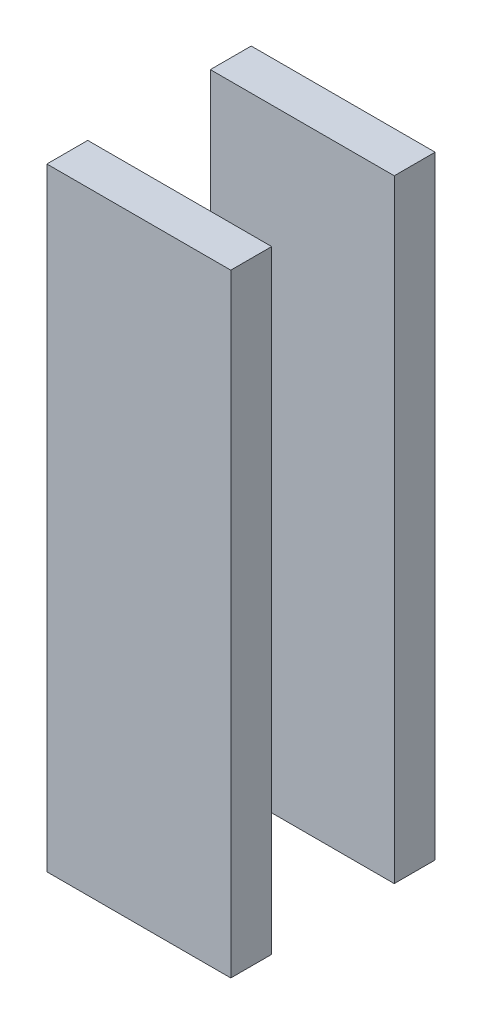
ISO-10303-21;
HEADER;
FILE_DESCRIPTION(('STEP AP214'),'2;1');
FILE_NAME('part.step','',(''),(''),'','','');
FILE_SCHEMA(('AUTOMOTIVE_DESIGN { 1 0 10303 214 1 1 1 1 }'));
ENDSEC;
DATA;
#1=APPLICATION_CONTEXT('core data for automotive mechanical design processes');
#2=APPLICATION_PROTOCOL_DEFINITION('international standard','automotive_design',2000,#1);
#3=PRODUCT_CONTEXT('',#1,'mechanical');
#4=PRODUCT('Part','Part','',(#3));
#5=PRODUCT_RELATED_PRODUCT_CATEGORY('part','',(#4));
#6=PRODUCT_DEFINITION_FORMATION('','',#4);
#7=PRODUCT_DEFINITION_CONTEXT('part definition',#1,'design');
#8=PRODUCT_DEFINITION('design','',#6,#7);
#9=PRODUCT_DEFINITION_SHAPE('','',#8);
#10=(LENGTH_UNIT() NAMED_UNIT(*) SI_UNIT(.MILLI.,.METRE.));
#11=(NAMED_UNIT(*) PLANE_ANGLE_UNIT() SI_UNIT($,.RADIAN.));
#12=(NAMED_UNIT(*) SI_UNIT($,.STERADIAN.) SOLID_ANGLE_UNIT());
#13=UNCERTAINTY_MEASURE_WITH_UNIT(LENGTH_MEASURE(1.E-05),#10,'distance_accuracy_value','');
#14=(GEOMETRIC_REPRESENTATION_CONTEXT(3) GLOBAL_UNCERTAINTY_ASSIGNED_CONTEXT((#13)) GLOBAL_UNIT_ASSIGNED_CONTEXT((#10,
#11,#12)) REPRESENTATION_CONTEXT('',''));
#15=CARTESIAN_POINT('',(0.,0.,0.));
#16=DIRECTION('',(0.,0.,1.));
#17=DIRECTION('',(1.,0.,0.));
#18=AXIS2_PLACEMENT_3D('',#15,#16,#17);
#19=CARTESIAN_POINT('',(-11.5229110512129,150.,-5.36388140161725));
#20=DIRECTION('',(1.,0.,0.));
#21=DIRECTION('',(0.,0.,-1.));
#22=AXIS2_PLACEMENT_3D('',#19,#20,#21);
#23=PLANE('',#22);
#24=DIRECTION('',(0.,0.,1.));
#25=VECTOR('',#24,1.);
#26=CARTESIAN_POINT('',(-11.5229110512129,0.,-5.36388140161725));
#27=LINE('',#26,#25);
#28=CARTESIAN_POINT('',(-11.5229110512129,0.,-5.36388140161725));
#29=VERTEX_POINT('',#28);
#30=CARTESIAN_POINT('',(-11.5229110512129,0.,4.63611859838275));
#31=VERTEX_POINT('',#30);
#32=EDGE_CURVE('E108',#29,#31,#27,.T.);
#33=ORIENTED_EDGE('',*,*,#32,.T.);
#34=DIRECTION('',(0.,-1.,0.));
#35=VECTOR('',#34,1.);
#36=CARTESIAN_POINT('',(-11.5229110512129,150.,4.63611859838275));
#37=LINE('',#36,#35);
#38=CARTESIAN_POINT('',(-11.5229110512129,150.,4.63611859838275));
#39=VERTEX_POINT('',#38);
#40=EDGE_CURVE('E12',#39,#31,#37,.T.);
#41=ORIENTED_EDGE('',*,*,#40,.F.);
#42=DIRECTION('',(0.,0.,1.));
#43=VECTOR('',#42,1.);
#44=CARTESIAN_POINT('',(-11.5229110512129,150.,-5.36388140161725));
#45=LINE('',#44,#43);
#46=CARTESIAN_POINT('',(-11.5229110512129,150.,-5.36388140161725));
#47=VERTEX_POINT('',#46);
#48=EDGE_CURVE('E96',#47,#39,#45,.T.);
#49=ORIENTED_EDGE('',*,*,#48,.F.);
#50=DIRECTION('',(0.,-1.,0.));
#51=VECTOR('',#50,1.);
#52=CARTESIAN_POINT('',(-11.5229110512129,150.,-5.36388140161725));
#53=LINE('',#52,#51);
#54=EDGE_CURVE('E104',#47,#29,#53,.T.);
#55=ORIENTED_EDGE('',*,*,#54,.T.);
#56=EDGE_LOOP('',(#33,#41,#49,#55));
#57=FACE_BOUND('',#56,.T.);
#58=ADVANCED_FACE('F45',(#57),#23,.F.);
#59=CARTESIAN_POINT('',(-11.5229110512129,150.,4.63611859838275));
#60=DIRECTION('',(0.,0.,-1.));
#61=DIRECTION('',(-1.,0.,0.));
#62=AXIS2_PLACEMENT_3D('',#59,#60,#61);
#63=PLANE('',#62);
#64=DIRECTION('',(1.,0.,0.));
#65=VECTOR('',#64,1.);
#66=CARTESIAN_POINT('',(-11.5229110512129,0.,4.63611859838275));
#67=LINE('',#66,#65);
#68=CARTESIAN_POINT('',(33.4770889487871,0.,4.63611859838275));
#69=VERTEX_POINT('',#68);
#70=EDGE_CURVE('E100',#31,#69,#67,.T.);
#71=ORIENTED_EDGE('',*,*,#70,.T.);
#72=DIRECTION('',(0.,-1.,0.));
#73=VECTOR('',#72,1.);
#74=CARTESIAN_POINT('',(33.4770889487871,150.,4.63611859838275));
#75=LINE('',#74,#73);
#76=CARTESIAN_POINT('',(33.4770889487871,150.,4.63611859838275));
#77=VERTEX_POINT('',#76);
#78=EDGE_CURVE('E53',#77,#69,#75,.T.);
#79=ORIENTED_EDGE('',*,*,#78,.F.);
#80=DIRECTION('',(1.,0.,0.));
#81=VECTOR('',#80,1.);
#82=CARTESIAN_POINT('',(-11.5229110512129,150.,4.63611859838275));
#83=LINE('',#82,#81);
#84=EDGE_CURVE('E91',#39,#77,#83,.T.);
#85=ORIENTED_EDGE('',*,*,#84,.F.);
#86=ORIENTED_EDGE('',*,*,#40,.T.);
#87=EDGE_LOOP('',(#71,#79,#85,#86));
#88=FACE_BOUND('',#87,.T.);
#89=ADVANCED_FACE('F99',(#88),#63,.F.);
#90=CARTESIAN_POINT('',(33.4770889487871,150.,-5.36388140161726));
#91=DIRECTION('',(-1.,0.,0.));
#92=DIRECTION('',(0.,0.,1.));
#93=AXIS2_PLACEMENT_3D('',#90,#91,#92);
#94=PLANE('',#93);
#95=DIRECTION('',(0.,0.,-1.));
#96=VECTOR('',#95,1.);
#97=CARTESIAN_POINT('',(33.4770889487871,0.,-5.36388140161726));
#98=LINE('',#97,#96);
#99=CARTESIAN_POINT('',(33.4770889487871,0.,-5.36388140161726));
#100=VERTEX_POINT('',#99);
#101=EDGE_CURVE('E78',#69,#100,#98,.T.);
#102=ORIENTED_EDGE('',*,*,#101,.T.);
#103=DIRECTION('',(0.,-1.,0.));
#104=VECTOR('',#103,1.);
#105=CARTESIAN_POINT('',(33.4770889487871,150.,-5.36388140161726));
#106=LINE('',#105,#104);
#107=CARTESIAN_POINT('',(33.4770889487871,150.,-5.36388140161726));
#108=VERTEX_POINT('',#107);
#109=EDGE_CURVE('E101',#108,#100,#106,.T.);
#110=ORIENTED_EDGE('',*,*,#109,.F.);
#111=DIRECTION('',(0.,0.,-1.));
#112=VECTOR('',#111,1.);
#113=CARTESIAN_POINT('',(33.4770889487871,150.,-5.36388140161726));
#114=LINE('',#113,#112);
#115=EDGE_CURVE('E94',#77,#108,#114,.T.);
#116=ORIENTED_EDGE('',*,*,#115,.F.);
#117=ORIENTED_EDGE('',*,*,#78,.T.);
#118=EDGE_LOOP('',(#102,#110,#116,#117));
#119=FACE_BOUND('',#118,.T.);
#120=ADVANCED_FACE('F102',(#119),#94,.F.);
#121=CARTESIAN_POINT('',(-11.5229110512129,150.,-5.36388140161725));
#122=DIRECTION('',(0.,0.,1.));
#123=DIRECTION('',(1.,0.,0.));
#124=AXIS2_PLACEMENT_3D('',#121,#122,#123);
#125=PLANE('',#124);
#126=DIRECTION('',(-1.,0.,0.));
#127=VECTOR('',#126,1.);
#128=CARTESIAN_POINT('',(-11.5229110512129,0.,-5.36388140161725));
#129=LINE('',#128,#127);
#130=EDGE_CURVE('E84',#100,#29,#129,.T.);
#131=ORIENTED_EDGE('',*,*,#130,.T.);
#132=ORIENTED_EDGE('',*,*,#54,.F.);
#133=DIRECTION('',(-1.,0.,0.));
#134=VECTOR('',#133,1.);
#135=CARTESIAN_POINT('',(-11.5229110512129,150.,-5.36388140161725));
#136=LINE('',#135,#134);
#137=EDGE_CURVE('E61',#108,#47,#136,.T.);
#138=ORIENTED_EDGE('',*,*,#137,.F.);
#139=ORIENTED_EDGE('',*,*,#109,.T.);
#140=EDGE_LOOP('',(#131,#132,#138,#139));
#141=FACE_BOUND('',#140,.T.);
#142=ADVANCED_FACE('F115',(#141),#125,.F.);
#143=CARTESIAN_POINT('',(0.,150.,0.));
#144=DIRECTION('',(0.,1.,0.));
#145=DIRECTION('',(0.,0.,1.));
#146=AXIS2_PLACEMENT_3D('',#143,#144,#145);
#147=PLANE('',#146);
#148=ORIENTED_EDGE('',*,*,#48,.T.);
#149=ORIENTED_EDGE('',*,*,#84,.T.);
#150=ORIENTED_EDGE('',*,*,#115,.T.);
#151=ORIENTED_EDGE('',*,*,#137,.T.);
#152=EDGE_LOOP('',(#148,#149,#150,#151));
#153=FACE_BOUND('',#152,.T.);
#154=ADVANCED_FACE('F92',(#153),#147,.T.);
#155=CARTESIAN_POINT('',(0.,0.,0.));
#156=DIRECTION('',(0.,1.,0.));
#157=DIRECTION('',(0.,0.,1.));
#158=AXIS2_PLACEMENT_3D('',#155,#156,#157);
#159=PLANE('',#158);
#160=ORIENTED_EDGE('',*,*,#32,.F.);
#161=ORIENTED_EDGE('',*,*,#130,.F.);
#162=ORIENTED_EDGE('',*,*,#101,.F.);
#163=ORIENTED_EDGE('',*,*,#70,.F.);
#164=EDGE_LOOP('',(#160,#161,#162,#163));
#165=FACE_BOUND('',#164,.T.);
#166=ADVANCED_FACE('F118',(#165),#159,.F.);
#167=CLOSED_SHELL('',(#58,#89,#120,#142,#154,#166));
#168=MANIFOLD_SOLID_BREP('B2',#167);
#169=CARTESIAN_POINT('',(-11.5229110512129,150.,-45.3638814016173));
#170=DIRECTION('',(1.,0.,0.));
#171=DIRECTION('',(0.,0.,-1.));
#172=AXIS2_PLACEMENT_3D('',#169,#170,#171);
#173=PLANE('',#172);
#174=DIRECTION('',(0.,0.,1.));
#175=VECTOR('',#174,1.);
#176=CARTESIAN_POINT('',(-11.5229110512129,0.,-45.3638814016173));
#177=LINE('',#176,#175);
#178=CARTESIAN_POINT('',(-11.5229110512129,0.,-45.3638814016173));
#179=VERTEX_POINT('',#178);
#180=CARTESIAN_POINT('',(-11.5229110512129,0.,-35.3638814016173));
#181=VERTEX_POINT('',#180);
#182=EDGE_CURVE('E232',#179,#181,#177,.T.);
#183=ORIENTED_EDGE('',*,*,#182,.T.);
#184=DIRECTION('',(0.,-1.,0.));
#185=VECTOR('',#184,1.);
#186=CARTESIAN_POINT('',(-11.5229110512129,150.,-35.3638814016173));
#187=LINE('',#186,#185);
#188=CARTESIAN_POINT('',(-11.5229110512129,150.,-35.3638814016173));
#189=VERTEX_POINT('',#188);
#190=EDGE_CURVE('E43',#189,#181,#187,.T.);
#191=ORIENTED_EDGE('',*,*,#190,.F.);
#192=DIRECTION('',(0.,0.,1.));
#193=VECTOR('',#192,1.);
#194=CARTESIAN_POINT('',(-11.5229110512129,150.,-45.3638814016173));
#195=LINE('',#194,#193);
#196=CARTESIAN_POINT('',(-11.5229110512129,150.,-45.3638814016173));
#197=VERTEX_POINT('',#196);
#198=EDGE_CURVE('E220',#197,#189,#195,.T.);
#199=ORIENTED_EDGE('',*,*,#198,.F.);
#200=DIRECTION('',(0.,-1.,0.));
#201=VECTOR('',#200,1.);
#202=CARTESIAN_POINT('',(-11.5229110512129,150.,-45.3638814016173));
#203=LINE('',#202,#201);
#204=EDGE_CURVE('E228',#197,#179,#203,.T.);
#205=ORIENTED_EDGE('',*,*,#204,.T.);
#206=EDGE_LOOP('',(#183,#191,#199,#205));
#207=FACE_BOUND('',#206,.T.);
#208=ADVANCED_FACE('F169',(#207),#173,.F.);
#209=CARTESIAN_POINT('',(-11.5229110512129,150.,-35.3638814016173));
#210=DIRECTION('',(0.,0.,-1.));
#211=DIRECTION('',(-1.,0.,0.));
#212=AXIS2_PLACEMENT_3D('',#209,#210,#211);
#213=PLANE('',#212);
#214=DIRECTION('',(1.,0.,0.));
#215=VECTOR('',#214,1.);
#216=CARTESIAN_POINT('',(-11.5229110512129,0.,-35.3638814016173));
#217=LINE('',#216,#215);
#218=CARTESIAN_POINT('',(33.4770889487871,0.,-35.3638814016173));
#219=VERTEX_POINT('',#218);
#220=EDGE_CURVE('E224',#181,#219,#217,.T.);
#221=ORIENTED_EDGE('',*,*,#220,.T.);
#222=DIRECTION('',(0.,-1.,0.));
#223=VECTOR('',#222,1.);
#224=CARTESIAN_POINT('',(33.4770889487871,150.,-35.3638814016173));
#225=LINE('',#224,#223);
#226=CARTESIAN_POINT('',(33.4770889487871,150.,-35.3638814016173));
#227=VERTEX_POINT('',#226);
#228=EDGE_CURVE('E177',#227,#219,#225,.T.);
#229=ORIENTED_EDGE('',*,*,#228,.F.);
#230=DIRECTION('',(1.,0.,0.));
#231=VECTOR('',#230,1.);
#232=CARTESIAN_POINT('',(-11.5229110512129,150.,-35.3638814016173));
#233=LINE('',#232,#231);
#234=EDGE_CURVE('E215',#189,#227,#233,.T.);
#235=ORIENTED_EDGE('',*,*,#234,.F.);
#236=ORIENTED_EDGE('',*,*,#190,.T.);
#237=EDGE_LOOP('',(#221,#229,#235,#236));
#238=FACE_BOUND('',#237,.T.);
#239=ADVANCED_FACE('F223',(#238),#213,.F.);
#240=CARTESIAN_POINT('',(33.4770889487871,150.,-45.3638814016173));
#241=DIRECTION('',(-1.,0.,0.));
#242=DIRECTION('',(0.,0.,1.));
#243=AXIS2_PLACEMENT_3D('',#240,#241,#242);
#244=PLANE('',#243);
#245=DIRECTION('',(0.,0.,-1.));
#246=VECTOR('',#245,1.);
#247=CARTESIAN_POINT('',(33.4770889487871,0.,-45.3638814016173));
#248=LINE('',#247,#246);
#249=CARTESIAN_POINT('',(33.4770889487871,0.,-45.3638814016173));
#250=VERTEX_POINT('',#249);
#251=EDGE_CURVE('E202',#219,#250,#248,.T.);
#252=ORIENTED_EDGE('',*,*,#251,.T.);
#253=DIRECTION('',(0.,-1.,0.));
#254=VECTOR('',#253,1.);
#255=CARTESIAN_POINT('',(33.4770889487871,150.,-45.3638814016173));
#256=LINE('',#255,#254);
#257=CARTESIAN_POINT('',(33.4770889487871,150.,-45.3638814016173));
#258=VERTEX_POINT('',#257);
#259=EDGE_CURVE('E225',#258,#250,#256,.T.);
#260=ORIENTED_EDGE('',*,*,#259,.F.);
#261=DIRECTION('',(0.,0.,-1.));
#262=VECTOR('',#261,1.);
#263=CARTESIAN_POINT('',(33.4770889487871,150.,-45.3638814016173));
#264=LINE('',#263,#262);
#265=EDGE_CURVE('E218',#227,#258,#264,.T.);
#266=ORIENTED_EDGE('',*,*,#265,.F.);
#267=ORIENTED_EDGE('',*,*,#228,.T.);
#268=EDGE_LOOP('',(#252,#260,#266,#267));
#269=FACE_BOUND('',#268,.T.);
#270=ADVANCED_FACE('F226',(#269),#244,.F.);
#271=CARTESIAN_POINT('',(-11.5229110512129,150.,-45.3638814016173));
#272=DIRECTION('',(0.,0.,1.));
#273=DIRECTION('',(1.,0.,0.));
#274=AXIS2_PLACEMENT_3D('',#271,#272,#273);
#275=PLANE('',#274);
#276=DIRECTION('',(-1.,0.,0.));
#277=VECTOR('',#276,1.);
#278=CARTESIAN_POINT('',(-11.5229110512129,0.,-45.3638814016173));
#279=LINE('',#278,#277);
#280=EDGE_CURVE('E208',#250,#179,#279,.T.);
#281=ORIENTED_EDGE('',*,*,#280,.T.);
#282=ORIENTED_EDGE('',*,*,#204,.F.);
#283=DIRECTION('',(-1.,0.,0.));
#284=VECTOR('',#283,1.);
#285=CARTESIAN_POINT('',(-11.5229110512129,150.,-45.3638814016173));
#286=LINE('',#285,#284);
#287=EDGE_CURVE('E185',#258,#197,#286,.T.);
#288=ORIENTED_EDGE('',*,*,#287,.F.);
#289=ORIENTED_EDGE('',*,*,#259,.T.);
#290=EDGE_LOOP('',(#281,#282,#288,#289));
#291=FACE_BOUND('',#290,.T.);
#292=ADVANCED_FACE('F239',(#291),#275,.F.);
#293=CARTESIAN_POINT('',(0.,150.,0.));
#294=DIRECTION('',(0.,1.,0.));
#295=DIRECTION('',(0.,0.,1.));
#296=AXIS2_PLACEMENT_3D('',#293,#294,#295);
#297=PLANE('',#296);
#298=ORIENTED_EDGE('',*,*,#198,.T.);
#299=ORIENTED_EDGE('',*,*,#234,.T.);
#300=ORIENTED_EDGE('',*,*,#265,.T.);
#301=ORIENTED_EDGE('',*,*,#287,.T.);
#302=EDGE_LOOP('',(#298,#299,#300,#301));
#303=FACE_BOUND('',#302,.T.);
#304=ADVANCED_FACE('F216',(#303),#297,.T.);
#305=CARTESIAN_POINT('',(0.,0.,0.));
#306=DIRECTION('',(0.,1.,0.));
#307=DIRECTION('',(0.,0.,1.));
#308=AXIS2_PLACEMENT_3D('',#305,#306,#307);
#309=PLANE('',#308);
#310=ORIENTED_EDGE('',*,*,#182,.F.);
#311=ORIENTED_EDGE('',*,*,#280,.F.);
#312=ORIENTED_EDGE('',*,*,#251,.F.);
#313=ORIENTED_EDGE('',*,*,#220,.F.);
#314=EDGE_LOOP('',(#310,#311,#312,#313));
#315=FACE_BOUND('',#314,.T.);
#316=ADVANCED_FACE('F242',(#315),#309,.F.);
#317=CLOSED_SHELL('',(#208,#239,#270,#292,#304,#316));
#318=MANIFOLD_SOLID_BREP('B6',#317);
#319=ADVANCED_BREP_SHAPE_REPRESENTATION('',(#18,#168,#318),#14);
#320=SHAPE_DEFINITION_REPRESENTATION(#9,#319);
ENDSEC;
END-ISO-10303-21;
